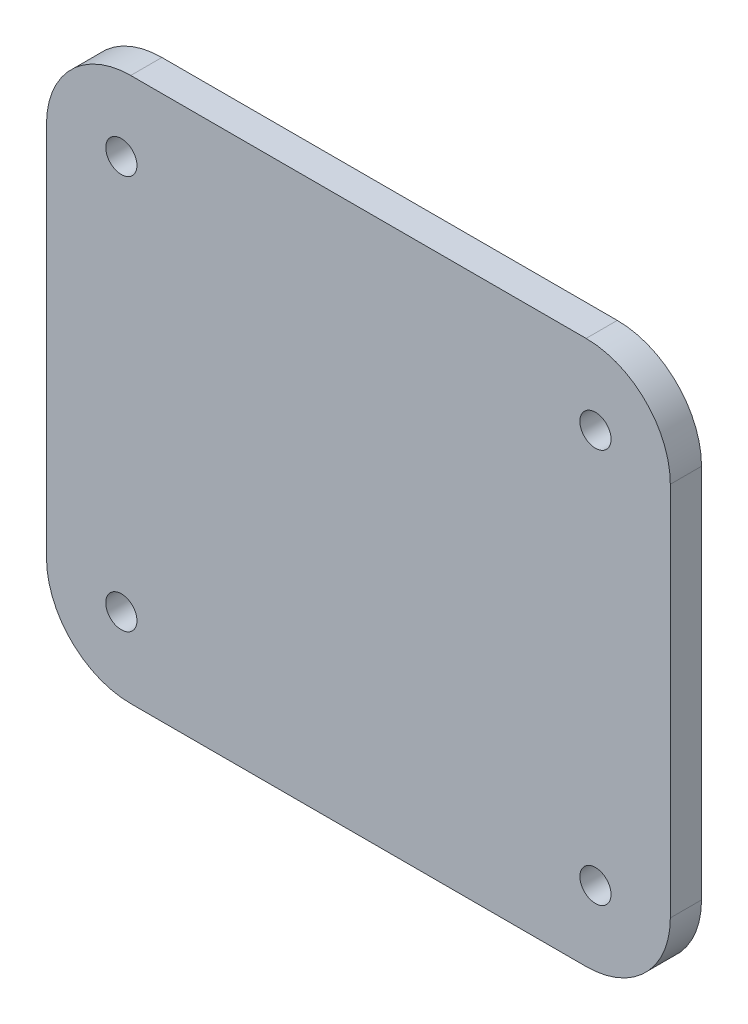
ISO-10303-21;
HEADER;
FILE_DESCRIPTION(('STEP AP214'),'2;1');
FILE_NAME('part.step','',(''),(''),'','','');
FILE_SCHEMA(('AUTOMOTIVE_DESIGN { 1 0 10303 214 1 1 1 1 }'));
ENDSEC;
DATA;
#1=APPLICATION_CONTEXT('core data for automotive mechanical design processes');
#2=APPLICATION_PROTOCOL_DEFINITION('international standard','automotive_design',2000,#1);
#3=PRODUCT_CONTEXT('',#1,'mechanical');
#4=PRODUCT('Part','Part','',(#3));
#5=PRODUCT_RELATED_PRODUCT_CATEGORY('part','',(#4));
#6=PRODUCT_DEFINITION_FORMATION('','',#4);
#7=PRODUCT_DEFINITION_CONTEXT('part definition',#1,'design');
#8=PRODUCT_DEFINITION('design','',#6,#7);
#9=PRODUCT_DEFINITION_SHAPE('','',#8);
#10=(LENGTH_UNIT() NAMED_UNIT(*) SI_UNIT(.MILLI.,.METRE.));
#11=(NAMED_UNIT(*) PLANE_ANGLE_UNIT() SI_UNIT($,.RADIAN.));
#12=(NAMED_UNIT(*) SI_UNIT($,.STERADIAN.) SOLID_ANGLE_UNIT());
#13=UNCERTAINTY_MEASURE_WITH_UNIT(LENGTH_MEASURE(1.E-05),#10,'distance_accuracy_value','');
#14=(GEOMETRIC_REPRESENTATION_CONTEXT(3) GLOBAL_UNCERTAINTY_ASSIGNED_CONTEXT((#13)) GLOBAL_UNIT_ASSIGNED_CONTEXT((#10,
#11,#12)) REPRESENTATION_CONTEXT('',''));
#15=CARTESIAN_POINT('',(0.,0.,0.));
#16=DIRECTION('',(0.,0.,1.));
#17=DIRECTION('',(1.,0.,0.));
#18=AXIS2_PLACEMENT_3D('',#15,#16,#17);
#19=CARTESIAN_POINT('',(50.,-43.6,5.));
#20=DIRECTION('',(-1.,0.,0.));
#21=DIRECTION('',(0.,0.,1.));
#22=AXIS2_PLACEMENT_3D('',#19,#20,#21);
#23=PLANE('',#22);
#24=DIRECTION('',(0.,1.,0.));
#25=VECTOR('',#24,1.);
#26=CARTESIAN_POINT('',(50.,-43.6,5.));
#27=LINE('',#26,#25);
#28=CARTESIAN_POINT('',(50.,-30.1,5.));
#29=VERTEX_POINT('',#28);
#30=CARTESIAN_POINT('',(50.,30.1,5.));
#31=VERTEX_POINT('',#30);
#32=EDGE_CURVE('E124',#29,#31,#27,.T.);
#33=ORIENTED_EDGE('',*,*,#32,.F.);
#34=DIRECTION('',(0.,0.,-1.));
#35=VECTOR('',#34,1.);
#36=CARTESIAN_POINT('',(50.,-30.1,5.));
#37=LINE('',#36,#35);
#38=CARTESIAN_POINT('',(50.,-30.1,0.));
#39=VERTEX_POINT('',#38);
#40=EDGE_CURVE('E165',#29,#39,#37,.T.);
#41=ORIENTED_EDGE('',*,*,#40,.T.);
#42=DIRECTION('',(0.,1.,0.));
#43=VECTOR('',#42,1.);
#44=CARTESIAN_POINT('',(50.,-43.6,0.));
#45=LINE('',#44,#43);
#46=CARTESIAN_POINT('',(50.,30.1,0.));
#47=VERTEX_POINT('',#46);
#48=EDGE_CURVE('E136',#39,#47,#45,.T.);
#49=ORIENTED_EDGE('',*,*,#48,.T.);
#50=DIRECTION('',(0.,0.,-1.));
#51=VECTOR('',#50,1.);
#52=CARTESIAN_POINT('',(50.,30.1,5.));
#53=LINE('',#52,#51);
#54=EDGE_CURVE('E163',#47,#31,#53,.F.);
#55=ORIENTED_EDGE('',*,*,#54,.T.);
#56=EDGE_LOOP('',(#33,#41,#49,#55));
#57=FACE_BOUND('',#56,.T.);
#58=ADVANCED_FACE('F32',(#57),#23,.F.);
#59=CARTESIAN_POINT('',(-50.,43.6,5.));
#60=DIRECTION('',(0.,-1.,0.));
#61=DIRECTION('',(0.,0.,-1.));
#62=AXIS2_PLACEMENT_3D('',#59,#60,#61);
#63=PLANE('',#62);
#64=DIRECTION('',(-1.,0.,0.));
#65=VECTOR('',#64,1.);
#66=CARTESIAN_POINT('',(21.,43.6,5.));
#67=LINE('',#66,#65);
#68=CARTESIAN_POINT('',(36.5,43.6,5.));
#69=VERTEX_POINT('',#68);
#70=CARTESIAN_POINT('',(-36.5,43.6,5.));
#71=VERTEX_POINT('',#70);
#72=EDGE_CURVE('E127',#69,#71,#67,.T.);
#73=ORIENTED_EDGE('',*,*,#72,.F.);
#74=DIRECTION('',(0.,0.,-1.));
#75=VECTOR('',#74,1.);
#76=CARTESIAN_POINT('',(36.5,43.6,5.));
#77=LINE('',#76,#75);
#78=CARTESIAN_POINT('',(36.5,43.6,0.));
#79=VERTEX_POINT('',#78);
#80=EDGE_CURVE('E11',#69,#79,#77,.T.);
#81=ORIENTED_EDGE('',*,*,#80,.T.);
#82=DIRECTION('',(-1.,0.,0.));
#83=VECTOR('',#82,1.);
#84=CARTESIAN_POINT('',(-50.,43.6,0.));
#85=LINE('',#84,#83);
#86=CARTESIAN_POINT('',(-36.5,43.6,0.));
#87=VERTEX_POINT('',#86);
#88=EDGE_CURVE('E129',#79,#87,#85,.T.);
#89=ORIENTED_EDGE('',*,*,#88,.T.);
#90=DIRECTION('',(0.,0.,-1.));
#91=VECTOR('',#90,1.);
#92=CARTESIAN_POINT('',(-36.5,43.6,5.));
#93=LINE('',#92,#91);
#94=EDGE_CURVE('E40',#87,#71,#93,.F.);
#95=ORIENTED_EDGE('',*,*,#94,.T.);
#96=EDGE_LOOP('',(#73,#81,#89,#95));
#97=FACE_BOUND('',#96,.T.);
#98=ADVANCED_FACE('F210',(#97),#63,.F.);
#99=CARTESIAN_POINT('',(-50.,-43.6,5.));
#100=DIRECTION('',(1.,0.,0.));
#101=DIRECTION('',(0.,0.,-1.));
#102=AXIS2_PLACEMENT_3D('',#99,#100,#101);
#103=PLANE('',#102);
#104=DIRECTION('',(0.,-1.,0.));
#105=VECTOR('',#104,1.);
#106=CARTESIAN_POINT('',(-50.,-43.6,0.));
#107=LINE('',#106,#105);
#108=CARTESIAN_POINT('',(-50.,30.1,0.));
#109=VERTEX_POINT('',#108);
#110=CARTESIAN_POINT('',(-50.,-30.1,0.));
#111=VERTEX_POINT('',#110);
#112=EDGE_CURVE('E125',#109,#111,#107,.T.);
#113=ORIENTED_EDGE('',*,*,#112,.T.);
#114=DIRECTION('',(0.,0.,-1.));
#115=VECTOR('',#114,1.);
#116=CARTESIAN_POINT('',(-50.,-30.1,5.));
#117=LINE('',#116,#115);
#118=CARTESIAN_POINT('',(-50.,-30.1,5.));
#119=VERTEX_POINT('',#118);
#120=EDGE_CURVE('E103',#111,#119,#117,.F.);
#121=ORIENTED_EDGE('',*,*,#120,.T.);
#122=DIRECTION('',(0.,-1.,0.));
#123=VECTOR('',#122,1.);
#124=CARTESIAN_POINT('',(-50.,-43.6,5.));
#125=LINE('',#124,#123);
#126=CARTESIAN_POINT('',(-50.,30.1,5.));
#127=VERTEX_POINT('',#126);
#128=EDGE_CURVE('E178',#127,#119,#125,.T.);
#129=ORIENTED_EDGE('',*,*,#128,.F.);
#130=DIRECTION('',(0.,0.,-1.));
#131=VECTOR('',#130,1.);
#132=CARTESIAN_POINT('',(-50.,30.1,5.));
#133=LINE('',#132,#131);
#134=EDGE_CURVE('E108',#127,#109,#133,.T.);
#135=ORIENTED_EDGE('',*,*,#134,.T.);
#136=EDGE_LOOP('',(#113,#121,#129,#135));
#137=FACE_BOUND('',#136,.T.);
#138=ADVANCED_FACE('F208',(#137),#103,.F.);
#139=CARTESIAN_POINT('',(-50.,-43.6,5.));
#140=DIRECTION('',(0.,1.,0.));
#141=DIRECTION('',(0.,0.,1.));
#142=AXIS2_PLACEMENT_3D('',#139,#140,#141);
#143=PLANE('',#142);
#144=DIRECTION('',(1.,0.,0.));
#145=VECTOR('',#144,1.);
#146=CARTESIAN_POINT('',(-50.,-43.6,5.));
#147=LINE('',#146,#145);
#148=CARTESIAN_POINT('',(-36.5,-43.6,5.));
#149=VERTEX_POINT('',#148);
#150=CARTESIAN_POINT('',(36.5,-43.6,5.));
#151=VERTEX_POINT('',#150);
#152=EDGE_CURVE('E118',#149,#151,#147,.T.);
#153=ORIENTED_EDGE('',*,*,#152,.F.);
#154=DIRECTION('',(0.,0.,-1.));
#155=VECTOR('',#154,1.);
#156=CARTESIAN_POINT('',(-36.5,-43.6,5.));
#157=LINE('',#156,#155);
#158=CARTESIAN_POINT('',(-36.5,-43.6,0.));
#159=VERTEX_POINT('',#158);
#160=EDGE_CURVE('E102',#149,#159,#157,.T.);
#161=ORIENTED_EDGE('',*,*,#160,.T.);
#162=DIRECTION('',(1.,0.,0.));
#163=VECTOR('',#162,1.);
#164=CARTESIAN_POINT('',(-50.,-43.6,0.));
#165=LINE('',#164,#163);
#166=CARTESIAN_POINT('',(36.5,-43.6,0.));
#167=VERTEX_POINT('',#166);
#168=EDGE_CURVE('E115',#159,#167,#165,.T.);
#169=ORIENTED_EDGE('',*,*,#168,.T.);
#170=DIRECTION('',(0.,0.,-1.));
#171=VECTOR('',#170,1.);
#172=CARTESIAN_POINT('',(36.5,-43.6,5.));
#173=LINE('',#172,#171);
#174=EDGE_CURVE('E120',#167,#151,#173,.F.);
#175=ORIENTED_EDGE('',*,*,#174,.T.);
#176=EDGE_LOOP('',(#153,#161,#169,#175));
#177=FACE_BOUND('',#176,.T.);
#178=ADVANCED_FACE('F114',(#177),#143,.F.);
#179=CARTESIAN_POINT('',(0.,0.,5.));
#180=DIRECTION('',(0.,0.,-1.));
#181=DIRECTION('',(-1.,0.,0.));
#182=AXIS2_PLACEMENT_3D('',#179,#180,#181);
#183=PLANE('',#182);
#184=CARTESIAN_POINT('',(38.,31.6,5.));
#185=DIRECTION('',(0.,0.,1.));
#186=DIRECTION('',(1.,0.,0.));
#187=AXIS2_PLACEMENT_3D('',#184,#185,#186);
#188=CIRCLE('',#187,2.5);
#189=CARTESIAN_POINT('',(40.5,31.6,5.));
#190=VERTEX_POINT('',#189);
#191=EDGE_CURVE('E142',#190,#190,#188,.T.);
#192=ORIENTED_EDGE('',*,*,#191,.F.);
#193=EDGE_LOOP('',(#192));
#194=FACE_BOUND('',#193,.T.);
#195=CARTESIAN_POINT('',(-38.,31.6,5.));
#196=DIRECTION('',(0.,0.,1.));
#197=DIRECTION('',(1.,0.,0.));
#198=AXIS2_PLACEMENT_3D('',#195,#196,#197);
#199=CIRCLE('',#198,2.5);
#200=CARTESIAN_POINT('',(-35.5,31.6,5.));
#201=VERTEX_POINT('',#200);
#202=EDGE_CURVE('E187',#201,#201,#199,.T.);
#203=ORIENTED_EDGE('',*,*,#202,.F.);
#204=EDGE_LOOP('',(#203));
#205=FACE_BOUND('',#204,.T.);
#206=CARTESIAN_POINT('',(-38.,-31.6,5.));
#207=DIRECTION('',(0.,0.,1.));
#208=DIRECTION('',(1.,0.,0.));
#209=AXIS2_PLACEMENT_3D('',#206,#207,#208);
#210=CIRCLE('',#209,2.5);
#211=CARTESIAN_POINT('',(-35.5,-31.6,5.));
#212=VERTEX_POINT('',#211);
#213=EDGE_CURVE('E184',#212,#212,#210,.T.);
#214=ORIENTED_EDGE('',*,*,#213,.F.);
#215=EDGE_LOOP('',(#214));
#216=FACE_BOUND('',#215,.T.);
#217=CARTESIAN_POINT('',(38.,-31.6,5.));
#218=DIRECTION('',(0.,0.,1.));
#219=DIRECTION('',(1.,0.,0.));
#220=AXIS2_PLACEMENT_3D('',#217,#218,#219);
#221=CIRCLE('',#220,2.5);
#222=CARTESIAN_POINT('',(40.5,-31.6,5.));
#223=VERTEX_POINT('',#222);
#224=EDGE_CURVE('E137',#223,#223,#221,.T.);
#225=ORIENTED_EDGE('',*,*,#224,.F.);
#226=EDGE_LOOP('',(#225));
#227=FACE_BOUND('',#226,.T.);
#228=ORIENTED_EDGE('',*,*,#128,.T.);
#229=CARTESIAN_POINT('',(-36.5,-30.1,5.));
#230=DIRECTION('',(0.,0.,-1.));
#231=DIRECTION('',(-1.,0.,0.));
#232=AXIS2_PLACEMENT_3D('',#229,#230,#231);
#233=CIRCLE('',#232,13.5);
#234=EDGE_CURVE('E161',#119,#149,#233,.F.);
#235=ORIENTED_EDGE('',*,*,#234,.T.);
#236=ORIENTED_EDGE('',*,*,#152,.T.);
#237=CARTESIAN_POINT('',(36.5,-30.1,5.));
#238=DIRECTION('',(0.,0.,-1.));
#239=DIRECTION('',(-1.,0.,0.));
#240=AXIS2_PLACEMENT_3D('',#237,#238,#239);
#241=CIRCLE('',#240,13.5);
#242=EDGE_CURVE('E159',#151,#29,#241,.F.);
#243=ORIENTED_EDGE('',*,*,#242,.T.);
#244=ORIENTED_EDGE('',*,*,#32,.T.);
#245=CARTESIAN_POINT('',(36.5,30.1,5.));
#246=DIRECTION('',(0.,0.,-1.));
#247=DIRECTION('',(-1.,0.,0.));
#248=AXIS2_PLACEMENT_3D('',#245,#246,#247);
#249=CIRCLE('',#248,13.5);
#250=EDGE_CURVE('E53',#31,#69,#249,.F.);
#251=ORIENTED_EDGE('',*,*,#250,.T.);
#252=ORIENTED_EDGE('',*,*,#72,.T.);
#253=CARTESIAN_POINT('',(-36.5,30.1,5.));
#254=DIRECTION('',(0.,0.,-1.));
#255=DIRECTION('',(-1.,0.,0.));
#256=AXIS2_PLACEMENT_3D('',#253,#254,#255);
#257=CIRCLE('',#256,13.5);
#258=EDGE_CURVE('E156',#71,#127,#257,.F.);
#259=ORIENTED_EDGE('',*,*,#258,.T.);
#260=EDGE_LOOP('',(#228,#235,#236,#243,#244,#251,#252,#259));
#261=FACE_BOUND('',#260,.T.);
#262=ADVANCED_FACE('F195',(#194,#205,#216,#227,#261),#183,.F.);
#263=CARTESIAN_POINT('',(0.,0.,0.));
#264=DIRECTION('',(0.,0.,-1.));
#265=DIRECTION('',(-1.,0.,0.));
#266=AXIS2_PLACEMENT_3D('',#263,#264,#265);
#267=PLANE('',#266);
#268=CARTESIAN_POINT('',(38.,31.6,0.));
#269=DIRECTION('',(0.,0.,-1.));
#270=DIRECTION('',(-1.,0.,0.));
#271=AXIS2_PLACEMENT_3D('',#268,#269,#270);
#272=CIRCLE('',#271,2.5);
#273=CARTESIAN_POINT('',(35.5,31.6,0.));
#274=VERTEX_POINT('',#273);
#275=EDGE_CURVE('E145',#274,#274,#272,.T.);
#276=ORIENTED_EDGE('',*,*,#275,.F.);
#277=EDGE_LOOP('',(#276));
#278=FACE_BOUND('',#277,.T.);
#279=CARTESIAN_POINT('',(-38.,31.6,0.));
#280=DIRECTION('',(0.,0.,-1.));
#281=DIRECTION('',(-1.,0.,0.));
#282=AXIS2_PLACEMENT_3D('',#279,#280,#281);
#283=CIRCLE('',#282,2.5);
#284=CARTESIAN_POINT('',(-40.5,31.6,0.));
#285=VERTEX_POINT('',#284);
#286=EDGE_CURVE('E141',#285,#285,#283,.T.);
#287=ORIENTED_EDGE('',*,*,#286,.F.);
#288=EDGE_LOOP('',(#287));
#289=FACE_BOUND('',#288,.T.);
#290=CARTESIAN_POINT('',(-38.,-31.6,0.));
#291=DIRECTION('',(0.,0.,-1.));
#292=DIRECTION('',(-1.,0.,0.));
#293=AXIS2_PLACEMENT_3D('',#290,#291,#292);
#294=CIRCLE('',#293,2.5);
#295=CARTESIAN_POINT('',(-40.5,-31.6,0.));
#296=VERTEX_POINT('',#295);
#297=EDGE_CURVE('E138',#296,#296,#294,.T.);
#298=ORIENTED_EDGE('',*,*,#297,.F.);
#299=EDGE_LOOP('',(#298));
#300=FACE_BOUND('',#299,.T.);
#301=CARTESIAN_POINT('',(38.,-31.6,0.));
#302=DIRECTION('',(0.,0.,-1.));
#303=DIRECTION('',(-1.,0.,0.));
#304=AXIS2_PLACEMENT_3D('',#301,#302,#303);
#305=CIRCLE('',#304,2.5);
#306=CARTESIAN_POINT('',(35.5,-31.6,0.));
#307=VERTEX_POINT('',#306);
#308=EDGE_CURVE('E133',#307,#307,#305,.T.);
#309=ORIENTED_EDGE('',*,*,#308,.F.);
#310=EDGE_LOOP('',(#309));
#311=FACE_BOUND('',#310,.T.);
#312=ORIENTED_EDGE('',*,*,#168,.F.);
#313=CARTESIAN_POINT('',(-36.5,-30.1,0.));
#314=DIRECTION('',(0.,0.,-1.));
#315=DIRECTION('',(-1.,0.,0.));
#316=AXIS2_PLACEMENT_3D('',#313,#314,#315);
#317=CIRCLE('',#316,13.5);
#318=EDGE_CURVE('E98',#159,#111,#317,.T.);
#319=ORIENTED_EDGE('',*,*,#318,.T.);
#320=ORIENTED_EDGE('',*,*,#112,.F.);
#321=CARTESIAN_POINT('',(-36.5,30.1,0.));
#322=DIRECTION('',(0.,0.,-1.));
#323=DIRECTION('',(-1.,0.,0.));
#324=AXIS2_PLACEMENT_3D('',#321,#322,#323);
#325=CIRCLE('',#324,13.5);
#326=EDGE_CURVE('E119',#109,#87,#325,.T.);
#327=ORIENTED_EDGE('',*,*,#326,.T.);
#328=ORIENTED_EDGE('',*,*,#88,.F.);
#329=CARTESIAN_POINT('',(36.5,30.1,0.));
#330=DIRECTION('',(0.,0.,-1.));
#331=DIRECTION('',(-1.,0.,0.));
#332=AXIS2_PLACEMENT_3D('',#329,#330,#331);
#333=CIRCLE('',#332,13.5);
#334=EDGE_CURVE('E150',#79,#47,#333,.T.);
#335=ORIENTED_EDGE('',*,*,#334,.T.);
#336=ORIENTED_EDGE('',*,*,#48,.F.);
#337=CARTESIAN_POINT('',(36.5,-30.1,0.));
#338=DIRECTION('',(0.,0.,-1.));
#339=DIRECTION('',(-1.,0.,0.));
#340=AXIS2_PLACEMENT_3D('',#337,#338,#339);
#341=CIRCLE('',#340,13.5);
#342=EDGE_CURVE('E109',#39,#167,#341,.T.);
#343=ORIENTED_EDGE('',*,*,#342,.T.);
#344=EDGE_LOOP('',(#312,#319,#320,#327,#328,#335,#336,#343));
#345=FACE_BOUND('',#344,.T.);
#346=ADVANCED_FACE('F122',(#278,#289,#300,#311,#345),#267,.T.);
#347=CARTESIAN_POINT('',(38.,-31.6,-5.));
#348=DIRECTION('',(0.,0.,1.));
#349=DIRECTION('',(1.,0.,0.));
#350=AXIS2_PLACEMENT_3D('',#347,#348,#349);
#351=CYLINDRICAL_SURFACE('',#350,2.5);
#352=ORIENTED_EDGE('',*,*,#308,.T.);
#353=EDGE_LOOP('',(#352));
#354=FACE_BOUND('',#353,.T.);
#355=ORIENTED_EDGE('',*,*,#224,.T.);
#356=EDGE_LOOP('',(#355));
#357=FACE_BOUND('',#356,.T.);
#358=ADVANCED_FACE('F234',(#354,#357),#351,.F.);
#359=CARTESIAN_POINT('',(-38.,-31.6,-5.));
#360=DIRECTION('',(0.,0.,1.));
#361=DIRECTION('',(1.,0.,0.));
#362=AXIS2_PLACEMENT_3D('',#359,#360,#361);
#363=CYLINDRICAL_SURFACE('',#362,2.5);
#364=ORIENTED_EDGE('',*,*,#297,.T.);
#365=EDGE_LOOP('',(#364));
#366=FACE_BOUND('',#365,.T.);
#367=ORIENTED_EDGE('',*,*,#213,.T.);
#368=EDGE_LOOP('',(#367));
#369=FACE_BOUND('',#368,.T.);
#370=ADVANCED_FACE('F239',(#366,#369),#363,.F.);
#371=CARTESIAN_POINT('',(-38.,31.6,-5.));
#372=DIRECTION('',(0.,0.,1.));
#373=DIRECTION('',(1.,0.,0.));
#374=AXIS2_PLACEMENT_3D('',#371,#372,#373);
#375=CYLINDRICAL_SURFACE('',#374,2.5);
#376=ORIENTED_EDGE('',*,*,#286,.T.);
#377=EDGE_LOOP('',(#376));
#378=FACE_BOUND('',#377,.T.);
#379=ORIENTED_EDGE('',*,*,#202,.T.);
#380=EDGE_LOOP('',(#379));
#381=FACE_BOUND('',#380,.T.);
#382=ADVANCED_FACE('F243',(#378,#381),#375,.F.);
#383=CARTESIAN_POINT('',(38.,31.6,-5.));
#384=DIRECTION('',(0.,0.,1.));
#385=DIRECTION('',(1.,0.,0.));
#386=AXIS2_PLACEMENT_3D('',#383,#384,#385);
#387=CYLINDRICAL_SURFACE('',#386,2.5);
#388=ORIENTED_EDGE('',*,*,#275,.T.);
#389=EDGE_LOOP('',(#388));
#390=FACE_BOUND('',#389,.T.);
#391=ORIENTED_EDGE('',*,*,#191,.T.);
#392=EDGE_LOOP('',(#391));
#393=FACE_BOUND('',#392,.T.);
#394=ADVANCED_FACE('F193',(#390,#393),#387,.F.);
#395=CARTESIAN_POINT('',(-36.5,-30.1,5.));
#396=DIRECTION('',(0.,0.,-1.));
#397=DIRECTION('',(-1.,0.,0.));
#398=AXIS2_PLACEMENT_3D('',#395,#396,#397);
#399=CYLINDRICAL_SURFACE('',#398,13.5);
#400=ORIENTED_EDGE('',*,*,#234,.F.);
#401=ORIENTED_EDGE('',*,*,#120,.F.);
#402=ORIENTED_EDGE('',*,*,#318,.F.);
#403=ORIENTED_EDGE('',*,*,#160,.F.);
#404=EDGE_LOOP('',(#400,#401,#402,#403));
#405=FACE_BOUND('',#404,.T.);
#406=ADVANCED_FACE('F101',(#405),#399,.T.);
#407=CARTESIAN_POINT('',(36.5,-30.1,5.));
#408=DIRECTION('',(0.,0.,-1.));
#409=DIRECTION('',(-1.,0.,0.));
#410=AXIS2_PLACEMENT_3D('',#407,#408,#409);
#411=CYLINDRICAL_SURFACE('',#410,13.5);
#412=ORIENTED_EDGE('',*,*,#242,.F.);
#413=ORIENTED_EDGE('',*,*,#174,.F.);
#414=ORIENTED_EDGE('',*,*,#342,.F.);
#415=ORIENTED_EDGE('',*,*,#40,.F.);
#416=EDGE_LOOP('',(#412,#413,#414,#415));
#417=FACE_BOUND('',#416,.T.);
#418=ADVANCED_FACE('F214',(#417),#411,.T.);
#419=CARTESIAN_POINT('',(36.5,30.1,5.));
#420=DIRECTION('',(0.,0.,-1.));
#421=DIRECTION('',(-1.,0.,0.));
#422=AXIS2_PLACEMENT_3D('',#419,#420,#421);
#423=CYLINDRICAL_SURFACE('',#422,13.5);
#424=ORIENTED_EDGE('',*,*,#250,.F.);
#425=ORIENTED_EDGE('',*,*,#54,.F.);
#426=ORIENTED_EDGE('',*,*,#334,.F.);
#427=ORIENTED_EDGE('',*,*,#80,.F.);
#428=EDGE_LOOP('',(#424,#425,#426,#427));
#429=FACE_BOUND('',#428,.T.);
#430=ADVANCED_FACE('F213',(#429),#423,.T.);
#431=CARTESIAN_POINT('',(-36.5,30.1,5.));
#432=DIRECTION('',(0.,0.,-1.));
#433=DIRECTION('',(-1.,0.,0.));
#434=AXIS2_PLACEMENT_3D('',#431,#432,#433);
#435=CYLINDRICAL_SURFACE('',#434,13.5);
#436=ORIENTED_EDGE('',*,*,#258,.F.);
#437=ORIENTED_EDGE('',*,*,#94,.F.);
#438=ORIENTED_EDGE('',*,*,#326,.F.);
#439=ORIENTED_EDGE('',*,*,#134,.F.);
#440=EDGE_LOOP('',(#436,#437,#438,#439));
#441=FACE_BOUND('',#440,.T.);
#442=ADVANCED_FACE('F34',(#441),#435,.T.);
#443=CLOSED_SHELL('',(#58,#98,#138,#178,#262,#346,#358,#370,#382,#394,#406,#418,#430,#442));
#444=MANIFOLD_SOLID_BREP('B2',#443);
#445=ADVANCED_BREP_SHAPE_REPRESENTATION('',(#18,#444),#14);
#446=SHAPE_DEFINITION_REPRESENTATION(#9,#445);
ENDSEC;
END-ISO-10303-21;
